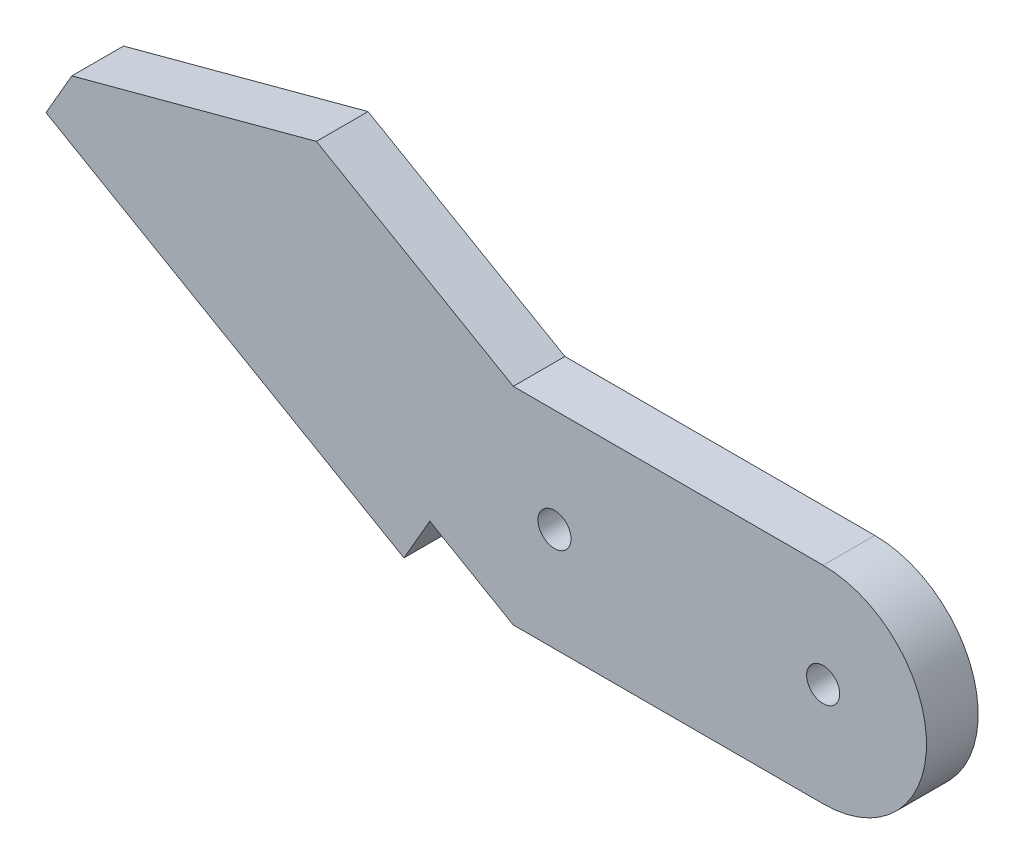
ISO-10303-21;
HEADER;
FILE_DESCRIPTION(('STEP AP214'),'2;1');
FILE_NAME('part.step','',(''),(''),'','','');
FILE_SCHEMA(('AUTOMOTIVE_DESIGN { 1 0 10303 214 1 1 1 1 }'));
ENDSEC;
DATA;
#1=APPLICATION_CONTEXT('core data for automotive mechanical design processes');
#2=APPLICATION_PROTOCOL_DEFINITION('international standard','automotive_design',2000,#1);
#3=PRODUCT_CONTEXT('',#1,'mechanical');
#4=PRODUCT('Part','Part','',(#3));
#5=PRODUCT_RELATED_PRODUCT_CATEGORY('part','',(#4));
#6=PRODUCT_DEFINITION_FORMATION('','',#4);
#7=PRODUCT_DEFINITION_CONTEXT('part definition',#1,'design');
#8=PRODUCT_DEFINITION('design','',#6,#7);
#9=PRODUCT_DEFINITION_SHAPE('','',#8);
#10=(LENGTH_UNIT() NAMED_UNIT(*) SI_UNIT(.MILLI.,.METRE.));
#11=(NAMED_UNIT(*) PLANE_ANGLE_UNIT() SI_UNIT($,.RADIAN.));
#12=(NAMED_UNIT(*) SI_UNIT($,.STERADIAN.) SOLID_ANGLE_UNIT());
#13=UNCERTAINTY_MEASURE_WITH_UNIT(LENGTH_MEASURE(1.E-05),#10,'distance_accuracy_value','');
#14=(GEOMETRIC_REPRESENTATION_CONTEXT(3) GLOBAL_UNCERTAINTY_ASSIGNED_CONTEXT((#13)) GLOBAL_UNIT_ASSIGNED_CONTEXT((#10,
#11,#12)) REPRESENTATION_CONTEXT('',''));
#15=CARTESIAN_POINT('',(0.,0.,0.));
#16=DIRECTION('',(0.,0.,1.));
#17=DIRECTION('',(1.,0.,0.));
#18=AXIS2_PLACEMENT_3D('',#15,#16,#17);
#19=CARTESIAN_POINT('',(0.,0.,5.));
#20=DIRECTION('',(0.,0.,1.));
#21=DIRECTION('',(1.,0.,0.));
#22=AXIS2_PLACEMENT_3D('',#19,#20,#21);
#23=PLANE('',#22);
#24=CARTESIAN_POINT('',(0.,0.,5.));
#25=DIRECTION('',(0.,0.,1.));
#26=DIRECTION('',(1.,0.,0.));
#27=AXIS2_PLACEMENT_3D('',#24,#25,#26);
#28=CIRCLE('',#27,1.6);
#29=CARTESIAN_POINT('',(1.6,0.,5.));
#30=VERTEX_POINT('',#29);
#31=EDGE_CURVE('E146',#30,#30,#28,.T.);
#32=ORIENTED_EDGE('',*,*,#31,.F.);
#33=EDGE_LOOP('',(#32));
#34=FACE_BOUND('',#33,.T.);
#35=CARTESIAN_POINT('',(0.,0.,5.));
#36=DIRECTION('',(0.,0.,1.));
#37=DIRECTION('',(1.,0.,0.));
#38=AXIS2_PLACEMENT_3D('',#35,#36,#37);
#39=CIRCLE('',#38,10.);
#40=CARTESIAN_POINT('',(0.,-10.,5.));
#41=VERTEX_POINT('',#40);
#42=CARTESIAN_POINT('',(0.,10.,5.));
#43=VERTEX_POINT('',#42);
#44=EDGE_CURVE('E159',#41,#43,#39,.T.);
#45=ORIENTED_EDGE('',*,*,#44,.T.);
#46=DIRECTION('',(-1.,0.,0.));
#47=VECTOR('',#46,1.);
#48=CARTESIAN_POINT('',(-29.992783873237,10.,5.));
#49=LINE('',#48,#47);
#50=CARTESIAN_POINT('',(-29.992783873237,10.,5.));
#51=VERTEX_POINT('',#50);
#52=EDGE_CURVE('E102',#43,#51,#49,.T.);
#53=ORIENTED_EDGE('',*,*,#52,.T.);
#54=DIRECTION('',(-0.86602540378444,0.499999999999998,0.));
#55=VECTOR('',#54,1.);
#56=CARTESIAN_POINT('',(-29.992783873237,10.,5.));
#57=LINE('',#56,#55);
#58=CARTESIAN_POINT('',(-49.0453427564947,21.,5.));
#59=VERTEX_POINT('',#58);
#60=EDGE_CURVE('E177',#51,#59,#57,.T.);
#61=ORIENTED_EDGE('',*,*,#60,.T.);
#62=DIRECTION('',(-0.965925826289066,-0.25881904510253,0.));
#63=VECTOR('',#62,1.);
#64=CARTESIAN_POINT('',(-72.7105255005765,14.658933394988,5.));
#65=LINE('',#64,#63);
#66=CARTESIAN_POINT('',(-72.7105255005765,14.658933394988,5.));
#67=VERTEX_POINT('',#66);
#68=EDGE_CURVE('E194',#59,#67,#65,.T.);
#69=ORIENTED_EDGE('',*,*,#68,.T.);
#70=DIRECTION('',(-0.499999999999998,-0.86602540378444,0.));
#71=VECTOR('',#70,1.);
#72=CARTESIAN_POINT('',(-72.7105255005765,14.658933394988,5.));
#73=LINE('',#72,#71);
#74=CARTESIAN_POINT('',(-75.2105255005765,10.3288063760658,5.));
#75=VERTEX_POINT('',#74);
#76=EDGE_CURVE('E193',#67,#75,#73,.T.);
#77=ORIENTED_EDGE('',*,*,#76,.T.);
#78=DIRECTION('',(0.86602540378444,-0.499999999999997,0.));
#79=VECTOR('',#78,1.);
#80=CARTESIAN_POINT('',(-75.2105255005765,10.3288063760658,5.));
#81=LINE('',#80,#79);
#82=CARTESIAN_POINT('',(-40.5695093491989,-9.67119362393404,5.));
#83=VERTEX_POINT('',#82);
#84=EDGE_CURVE('E124',#75,#83,#81,.T.);
#85=ORIENTED_EDGE('',*,*,#84,.T.);
#86=DIRECTION('',(0.499999999999995,0.866025403784442,0.));
#87=VECTOR('',#86,1.);
#88=CARTESIAN_POINT('',(-38.0695093491989,-5.34106660501183,5.));
#89=LINE('',#88,#87);
#90=CARTESIAN_POINT('',(-38.0695093491989,-5.34106660501183,5.));
#91=VERTEX_POINT('',#90);
#92=EDGE_CURVE('E118',#83,#91,#89,.T.);
#93=ORIENTED_EDGE('',*,*,#92,.T.);
#94=DIRECTION('',(0.86602540378444,-0.499999999999998,0.));
#95=VECTOR('',#94,1.);
#96=CARTESIAN_POINT('',(-30.,-10.,5.));
#97=LINE('',#96,#95);
#98=CARTESIAN_POINT('',(-30.,-10.,5.));
#99=VERTEX_POINT('',#98);
#100=EDGE_CURVE('E122',#91,#99,#97,.T.);
#101=ORIENTED_EDGE('',*,*,#100,.T.);
#102=DIRECTION('',(1.,0.,0.));
#103=VECTOR('',#102,1.);
#104=CARTESIAN_POINT('',(0.,-10.,5.));
#105=LINE('',#104,#103);
#106=EDGE_CURVE('E56',#99,#41,#105,.T.);
#107=ORIENTED_EDGE('',*,*,#106,.T.);
#108=EDGE_LOOP('',(#45,#53,#61,#69,#77,#85,#93,#101,#107));
#109=FACE_BOUND('',#108,.T.);
#110=CARTESIAN_POINT('',(-26.,0.,5.));
#111=DIRECTION('',(0.,0.,1.));
#112=DIRECTION('',(1.,0.,0.));
#113=AXIS2_PLACEMENT_3D('',#110,#111,#112);
#114=CIRCLE('',#113,1.6);
#115=CARTESIAN_POINT('',(-24.4,0.,5.));
#116=VERTEX_POINT('',#115);
#117=EDGE_CURVE('E204',#116,#116,#114,.T.);
#118=ORIENTED_EDGE('',*,*,#117,.F.);
#119=EDGE_LOOP('',(#118));
#120=FACE_BOUND('',#119,.T.);
#121=ADVANCED_FACE('F39',(#34,#109,#120),#23,.T.);
#122=CARTESIAN_POINT('',(0.,0.,0.));
#123=DIRECTION('',(0.,0.,1.));
#124=DIRECTION('',(1.,0.,0.));
#125=AXIS2_PLACEMENT_3D('',#122,#123,#124);
#126=PLANE('',#125);
#127=CARTESIAN_POINT('',(0.,0.,0.));
#128=DIRECTION('',(0.,0.,1.));
#129=DIRECTION('',(1.,0.,0.));
#130=AXIS2_PLACEMENT_3D('',#127,#128,#129);
#131=CIRCLE('',#130,10.);
#132=CARTESIAN_POINT('',(0.,-10.,0.));
#133=VERTEX_POINT('',#132);
#134=CARTESIAN_POINT('',(0.,10.,0.));
#135=VERTEX_POINT('',#134);
#136=EDGE_CURVE('E142',#133,#135,#131,.T.);
#137=ORIENTED_EDGE('',*,*,#136,.F.);
#138=DIRECTION('',(1.,0.,0.));
#139=VECTOR('',#138,1.);
#140=CARTESIAN_POINT('',(0.,-10.,0.));
#141=LINE('',#140,#139);
#142=CARTESIAN_POINT('',(-30.,-10.,0.));
#143=VERTEX_POINT('',#142);
#144=EDGE_CURVE('E94',#143,#133,#141,.T.);
#145=ORIENTED_EDGE('',*,*,#144,.F.);
#146=DIRECTION('',(0.86602540378444,-0.499999999999998,0.));
#147=VECTOR('',#146,1.);
#148=CARTESIAN_POINT('',(-30.,-10.,0.));
#149=LINE('',#148,#147);
#150=CARTESIAN_POINT('',(-38.0695093491989,-5.34106660501183,0.));
#151=VERTEX_POINT('',#150);
#152=EDGE_CURVE('E88',#151,#143,#149,.T.);
#153=ORIENTED_EDGE('',*,*,#152,.F.);
#154=DIRECTION('',(0.499999999999995,0.866025403784442,0.));
#155=VECTOR('',#154,1.);
#156=CARTESIAN_POINT('',(-38.0695093491989,-5.34106660501183,0.));
#157=LINE('',#156,#155);
#158=CARTESIAN_POINT('',(-40.5695093491989,-9.67119362393404,0.));
#159=VERTEX_POINT('',#158);
#160=EDGE_CURVE('E132',#159,#151,#157,.T.);
#161=ORIENTED_EDGE('',*,*,#160,.F.);
#162=DIRECTION('',(0.86602540378444,-0.499999999999997,0.));
#163=VECTOR('',#162,1.);
#164=CARTESIAN_POINT('',(-75.2105255005765,10.3288063760658,0.));
#165=LINE('',#164,#163);
#166=CARTESIAN_POINT('',(-75.2105255005765,10.3288063760658,0.));
#167=VERTEX_POINT('',#166);
#168=EDGE_CURVE('E154',#167,#159,#165,.T.);
#169=ORIENTED_EDGE('',*,*,#168,.F.);
#170=DIRECTION('',(-0.499999999999998,-0.86602540378444,0.));
#171=VECTOR('',#170,1.);
#172=CARTESIAN_POINT('',(-72.7105255005765,14.658933394988,0.));
#173=LINE('',#172,#171);
#174=CARTESIAN_POINT('',(-72.7105255005765,14.658933394988,0.));
#175=VERTEX_POINT('',#174);
#176=EDGE_CURVE('E152',#175,#167,#173,.T.);
#177=ORIENTED_EDGE('',*,*,#176,.F.);
#178=DIRECTION('',(-0.965925826289066,-0.25881904510253,0.));
#179=VECTOR('',#178,1.);
#180=CARTESIAN_POINT('',(-72.7105255005765,14.658933394988,0.));
#181=LINE('',#180,#179);
#182=CARTESIAN_POINT('',(-49.0453427564947,21.,0.));
#183=VERTEX_POINT('',#182);
#184=EDGE_CURVE('E150',#183,#175,#181,.T.);
#185=ORIENTED_EDGE('',*,*,#184,.F.);
#186=DIRECTION('',(-0.86602540378444,0.499999999999998,0.));
#187=VECTOR('',#186,1.);
#188=CARTESIAN_POINT('',(-29.992783873237,10.,0.));
#189=LINE('',#188,#187);
#190=CARTESIAN_POINT('',(-29.992783873237,10.,0.));
#191=VERTEX_POINT('',#190);
#192=EDGE_CURVE('E148',#191,#183,#189,.T.);
#193=ORIENTED_EDGE('',*,*,#192,.F.);
#194=DIRECTION('',(-1.,0.,0.));
#195=VECTOR('',#194,1.);
#196=CARTESIAN_POINT('',(-29.992783873237,10.,0.));
#197=LINE('',#196,#195);
#198=EDGE_CURVE('E145',#135,#191,#197,.T.);
#199=ORIENTED_EDGE('',*,*,#198,.F.);
#200=EDGE_LOOP('',(#137,#145,#153,#161,#169,#177,#185,#193,#199));
#201=FACE_BOUND('',#200,.T.);
#202=CARTESIAN_POINT('',(0.,0.,0.));
#203=DIRECTION('',(0.,0.,1.));
#204=DIRECTION('',(1.,0.,0.));
#205=AXIS2_PLACEMENT_3D('',#202,#203,#204);
#206=CIRCLE('',#205,1.6);
#207=CARTESIAN_POINT('',(1.6,0.,0.));
#208=VERTEX_POINT('',#207);
#209=EDGE_CURVE('E201',#208,#208,#206,.T.);
#210=ORIENTED_EDGE('',*,*,#209,.T.);
#211=EDGE_LOOP('',(#210));
#212=FACE_BOUND('',#211,.T.);
#213=CARTESIAN_POINT('',(-26.,0.,0.));
#214=DIRECTION('',(0.,0.,1.));
#215=DIRECTION('',(1.,0.,0.));
#216=AXIS2_PLACEMENT_3D('',#213,#214,#215);
#217=CIRCLE('',#216,1.6);
#218=CARTESIAN_POINT('',(-24.4,0.,0.));
#219=VERTEX_POINT('',#218);
#220=EDGE_CURVE('E207',#219,#219,#217,.T.);
#221=ORIENTED_EDGE('',*,*,#220,.T.);
#222=EDGE_LOOP('',(#221));
#223=FACE_BOUND('',#222,.T.);
#224=ADVANCED_FACE('F181',(#201,#212,#223),#126,.F.);
#225=CARTESIAN_POINT('',(0.,0.,5.));
#226=DIRECTION('',(0.,0.,-1.));
#227=DIRECTION('',(-1.,0.,0.));
#228=AXIS2_PLACEMENT_3D('',#225,#226,#227);
#229=CYLINDRICAL_SURFACE('',#228,10.);
#230=ORIENTED_EDGE('',*,*,#136,.T.);
#231=DIRECTION('',(0.,0.,-1.));
#232=VECTOR('',#231,1.);
#233=CARTESIAN_POINT('',(0.,10.,5.));
#234=LINE('',#233,#232);
#235=EDGE_CURVE('E11',#43,#135,#234,.T.);
#236=ORIENTED_EDGE('',*,*,#235,.F.);
#237=ORIENTED_EDGE('',*,*,#44,.F.);
#238=DIRECTION('',(0.,0.,-1.));
#239=VECTOR('',#238,1.);
#240=CARTESIAN_POINT('',(0.,-10.,5.));
#241=LINE('',#240,#239);
#242=EDGE_CURVE('E138',#41,#133,#241,.T.);
#243=ORIENTED_EDGE('',*,*,#242,.T.);
#244=EDGE_LOOP('',(#230,#236,#237,#243));
#245=FACE_BOUND('',#244,.T.);
#246=ADVANCED_FACE('F41',(#245),#229,.T.);
#247=CARTESIAN_POINT('',(-29.992783873237,10.,5.));
#248=DIRECTION('',(0.,-1.,0.));
#249=DIRECTION('',(1.,0.,0.));
#250=AXIS2_PLACEMENT_3D('',#247,#248,#249);
#251=PLANE('',#250);
#252=ORIENTED_EDGE('',*,*,#198,.T.);
#253=DIRECTION('',(0.,0.,-1.));
#254=VECTOR('',#253,1.);
#255=CARTESIAN_POINT('',(-29.992783873237,10.,5.));
#256=LINE('',#255,#254);
#257=EDGE_CURVE('E48',#51,#191,#256,.T.);
#258=ORIENTED_EDGE('',*,*,#257,.F.);
#259=ORIENTED_EDGE('',*,*,#52,.F.);
#260=ORIENTED_EDGE('',*,*,#235,.T.);
#261=EDGE_LOOP('',(#252,#258,#259,#260));
#262=FACE_BOUND('',#261,.T.);
#263=ADVANCED_FACE('F243',(#262),#251,.F.);
#264=CARTESIAN_POINT('',(-29.992783873237,10.,5.));
#265=DIRECTION('',(-0.499999999999998,-0.86602540378444,0.));
#266=DIRECTION('',(0.86602540378444,-0.499999999999998,0.));
#267=AXIS2_PLACEMENT_3D('',#264,#265,#266);
#268=PLANE('',#267);
#269=ORIENTED_EDGE('',*,*,#192,.T.);
#270=DIRECTION('',(0.,0.,-1.));
#271=VECTOR('',#270,1.);
#272=CARTESIAN_POINT('',(-49.0453427564947,21.,5.));
#273=LINE('',#272,#271);
#274=EDGE_CURVE('E169',#59,#183,#273,.T.);
#275=ORIENTED_EDGE('',*,*,#274,.F.);
#276=ORIENTED_EDGE('',*,*,#60,.F.);
#277=ORIENTED_EDGE('',*,*,#257,.T.);
#278=EDGE_LOOP('',(#269,#275,#276,#277));
#279=FACE_BOUND('',#278,.T.);
#280=ADVANCED_FACE('F175',(#279),#268,.F.);
#281=CARTESIAN_POINT('',(-72.7105255005765,14.658933394988,5.));
#282=DIRECTION('',(0.25881904510253,-0.965925826289066,0.));
#283=DIRECTION('',(0.965925826289066,0.25881904510253,0.));
#284=AXIS2_PLACEMENT_3D('',#281,#282,#283);
#285=PLANE('',#284);
#286=ORIENTED_EDGE('',*,*,#184,.T.);
#287=DIRECTION('',(0.,0.,-1.));
#288=VECTOR('',#287,1.);
#289=CARTESIAN_POINT('',(-72.7105255005765,14.658933394988,5.));
#290=LINE('',#289,#288);
#291=EDGE_CURVE('E166',#67,#175,#290,.T.);
#292=ORIENTED_EDGE('',*,*,#291,.F.);
#293=ORIENTED_EDGE('',*,*,#68,.F.);
#294=ORIENTED_EDGE('',*,*,#274,.T.);
#295=EDGE_LOOP('',(#286,#292,#293,#294));
#296=FACE_BOUND('',#295,.T.);
#297=ADVANCED_FACE('F187',(#296),#285,.F.);
#298=CARTESIAN_POINT('',(-72.7105255005765,14.658933394988,5.));
#299=DIRECTION('',(0.86602540378444,-0.499999999999998,0.));
#300=DIRECTION('',(0.499999999999998,0.86602540378444,0.));
#301=AXIS2_PLACEMENT_3D('',#298,#299,#300);
#302=PLANE('',#301);
#303=ORIENTED_EDGE('',*,*,#176,.T.);
#304=DIRECTION('',(0.,0.,-1.));
#305=VECTOR('',#304,1.);
#306=CARTESIAN_POINT('',(-75.2105255005765,10.3288063760658,5.));
#307=LINE('',#306,#305);
#308=EDGE_CURVE('E163',#75,#167,#307,.T.);
#309=ORIENTED_EDGE('',*,*,#308,.F.);
#310=ORIENTED_EDGE('',*,*,#76,.F.);
#311=ORIENTED_EDGE('',*,*,#291,.T.);
#312=EDGE_LOOP('',(#303,#309,#310,#311));
#313=FACE_BOUND('',#312,.T.);
#314=ADVANCED_FACE('F191',(#313),#302,.F.);
#315=CARTESIAN_POINT('',(-75.2105255005765,10.3288063760658,5.));
#316=DIRECTION('',(0.499999999999997,0.86602540378444,0.));
#317=DIRECTION('',(-0.86602540378444,0.499999999999997,0.));
#318=AXIS2_PLACEMENT_3D('',#315,#316,#317);
#319=PLANE('',#318);
#320=ORIENTED_EDGE('',*,*,#168,.T.);
#321=DIRECTION('',(0.,0.,-1.));
#322=VECTOR('',#321,1.);
#323=CARTESIAN_POINT('',(-40.5695093491989,-9.67119362393404,5.));
#324=LINE('',#323,#322);
#325=EDGE_CURVE('E133',#83,#159,#324,.T.);
#326=ORIENTED_EDGE('',*,*,#325,.F.);
#327=ORIENTED_EDGE('',*,*,#84,.F.);
#328=ORIENTED_EDGE('',*,*,#308,.T.);
#329=EDGE_LOOP('',(#320,#326,#327,#328));
#330=FACE_BOUND('',#329,.T.);
#331=ADVANCED_FACE('F234',(#330),#319,.F.);
#332=CARTESIAN_POINT('',(-38.0695093491989,-5.34106660501183,5.));
#333=DIRECTION('',(-0.866025403784442,0.499999999999995,0.));
#334=DIRECTION('',(-0.499999999999995,-0.866025403784442,0.));
#335=AXIS2_PLACEMENT_3D('',#332,#333,#334);
#336=PLANE('',#335);
#337=ORIENTED_EDGE('',*,*,#160,.T.);
#338=DIRECTION('',(0.,0.,-1.));
#339=VECTOR('',#338,1.);
#340=CARTESIAN_POINT('',(-38.0695093491989,-5.34106660501183,5.));
#341=LINE('',#340,#339);
#342=EDGE_CURVE('E129',#91,#151,#341,.T.);
#343=ORIENTED_EDGE('',*,*,#342,.F.);
#344=ORIENTED_EDGE('',*,*,#92,.F.);
#345=ORIENTED_EDGE('',*,*,#325,.T.);
#346=EDGE_LOOP('',(#337,#343,#344,#345));
#347=FACE_BOUND('',#346,.T.);
#348=ADVANCED_FACE('F130',(#347),#336,.F.);
#349=CARTESIAN_POINT('',(-30.,-10.,5.));
#350=DIRECTION('',(0.499999999999998,0.86602540378444,0.));
#351=DIRECTION('',(-0.86602540378444,0.499999999999998,0.));
#352=AXIS2_PLACEMENT_3D('',#349,#350,#351);
#353=PLANE('',#352);
#354=ORIENTED_EDGE('',*,*,#152,.T.);
#355=DIRECTION('',(0.,0.,-1.));
#356=VECTOR('',#355,1.);
#357=CARTESIAN_POINT('',(-30.,-10.,5.));
#358=LINE('',#357,#356);
#359=EDGE_CURVE('E134',#99,#143,#358,.T.);
#360=ORIENTED_EDGE('',*,*,#359,.F.);
#361=ORIENTED_EDGE('',*,*,#100,.F.);
#362=ORIENTED_EDGE('',*,*,#342,.T.);
#363=EDGE_LOOP('',(#354,#360,#361,#362));
#364=FACE_BOUND('',#363,.T.);
#365=ADVANCED_FACE('F136',(#364),#353,.F.);
#366=CARTESIAN_POINT('',(0.,-10.,5.));
#367=DIRECTION('',(0.,1.,0.));
#368=DIRECTION('',(-1.,0.,0.));
#369=AXIS2_PLACEMENT_3D('',#366,#367,#368);
#370=PLANE('',#369);
#371=ORIENTED_EDGE('',*,*,#144,.T.);
#372=ORIENTED_EDGE('',*,*,#242,.F.);
#373=ORIENTED_EDGE('',*,*,#106,.F.);
#374=ORIENTED_EDGE('',*,*,#359,.T.);
#375=EDGE_LOOP('',(#371,#372,#373,#374));
#376=FACE_BOUND('',#375,.T.);
#377=ADVANCED_FACE('F227',(#376),#370,.F.);
#378=CARTESIAN_POINT('',(0.,0.,5.));
#379=DIRECTION('',(0.,0.,-1.));
#380=DIRECTION('',(-1.,0.,0.));
#381=AXIS2_PLACEMENT_3D('',#378,#379,#380);
#382=CYLINDRICAL_SURFACE('',#381,1.6);
#383=ORIENTED_EDGE('',*,*,#31,.T.);
#384=EDGE_LOOP('',(#383));
#385=FACE_BOUND('',#384,.T.);
#386=ORIENTED_EDGE('',*,*,#209,.F.);
#387=EDGE_LOOP('',(#386));
#388=FACE_BOUND('',#387,.T.);
#389=ADVANCED_FACE('F224',(#385,#388),#382,.F.);
#390=CARTESIAN_POINT('',(-26.,0.,5.));
#391=DIRECTION('',(0.,0.,-1.));
#392=DIRECTION('',(-1.,0.,0.));
#393=AXIS2_PLACEMENT_3D('',#390,#391,#392);
#394=CYLINDRICAL_SURFACE('',#393,1.6);
#395=ORIENTED_EDGE('',*,*,#117,.T.);
#396=EDGE_LOOP('',(#395));
#397=FACE_BOUND('',#396,.T.);
#398=ORIENTED_EDGE('',*,*,#220,.F.);
#399=EDGE_LOOP('',(#398));
#400=FACE_BOUND('',#399,.T.);
#401=ADVANCED_FACE('F213',(#397,#400),#394,.F.);
#402=CLOSED_SHELL('',(#121,#224,#246,#263,#280,#297,#314,#331,#348,#365,#377,#389,#401));
#403=MANIFOLD_SOLID_BREP('B2',#402);
#404=ADVANCED_BREP_SHAPE_REPRESENTATION('',(#18,#403),#14);
#405=SHAPE_DEFINITION_REPRESENTATION(#9,#404);
ENDSEC;
END-ISO-10303-21;
